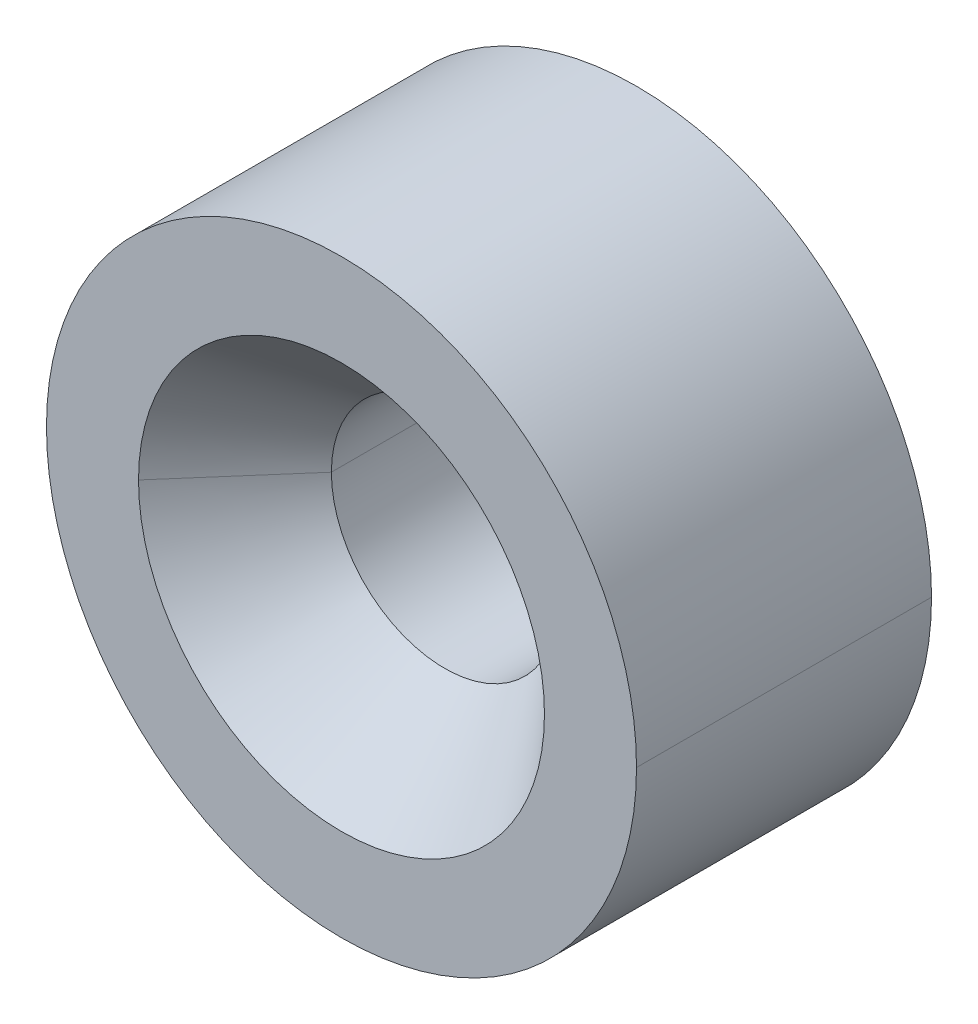
ISO-10303-21;
HEADER;
FILE_DESCRIPTION(('STEP AP214'),'2;1');
FILE_NAME('part.step','',(''),(''),'','','');
FILE_SCHEMA(('AUTOMOTIVE_DESIGN { 1 0 10303 214 1 1 1 1 }'));
ENDSEC;
DATA;
#1=APPLICATION_CONTEXT('core data for automotive mechanical design processes');
#2=APPLICATION_PROTOCOL_DEFINITION('international standard','automotive_design',2000,#1);
#3=PRODUCT_CONTEXT('',#1,'mechanical');
#4=PRODUCT('Part','Part','',(#3));
#5=PRODUCT_RELATED_PRODUCT_CATEGORY('part','',(#4));
#6=PRODUCT_DEFINITION_FORMATION('','',#4);
#7=PRODUCT_DEFINITION_CONTEXT('part definition',#1,'design');
#8=PRODUCT_DEFINITION('design','',#6,#7);
#9=PRODUCT_DEFINITION_SHAPE('','',#8);
#10=(LENGTH_UNIT() NAMED_UNIT(*) SI_UNIT(.MILLI.,.METRE.));
#11=(NAMED_UNIT(*) PLANE_ANGLE_UNIT() SI_UNIT($,.RADIAN.));
#12=(NAMED_UNIT(*) SI_UNIT($,.STERADIAN.) SOLID_ANGLE_UNIT());
#13=UNCERTAINTY_MEASURE_WITH_UNIT(LENGTH_MEASURE(1.E-05),#10,'distance_accuracy_value','');
#14=(GEOMETRIC_REPRESENTATION_CONTEXT(3) GLOBAL_UNCERTAINTY_ASSIGNED_CONTEXT((#13)) GLOBAL_UNIT_ASSIGNED_CONTEXT((#10,
#11,#12)) REPRESENTATION_CONTEXT('',''));
#15=CARTESIAN_POINT('',(0.,0.,0.));
#16=DIRECTION('',(0.,0.,1.));
#17=DIRECTION('',(1.,0.,0.));
#18=AXIS2_PLACEMENT_3D('',#15,#16,#17);
#19=CARTESIAN_POINT('',(0.,0.,3.175));
#20=DIRECTION('',(0.,0.,1.));
#21=DIRECTION('',(1.,0.,0.));
#22=AXIS2_PLACEMENT_3D('',#19,#20,#21);
#23=CONICAL_SURFACE('',#22,2.1844,0.715584993317676);
#24=CARTESIAN_POINT('',(0.,0.,2.06466441335028));
#25=DIRECTION('',(0.,0.,1.));
#26=DIRECTION('',(1.,0.,0.));
#27=AXIS2_PLACEMENT_3D('',#24,#25,#26);
#28=CIRCLE('',#27,1.2192);
#29=CARTESIAN_POINT('',(-1.2192,0.,2.06466441335028));
#30=VERTEX_POINT('',#29);
#31=CARTESIAN_POINT('',(1.2192,0.,2.06466441335028));
#32=VERTEX_POINT('',#31);
#33=EDGE_CURVE('E41',#30,#32,#28,.T.);
#34=ORIENTED_EDGE('',*,*,#33,.F.);
#35=DIRECTION('',(-0.656059028990508,0.,0.754709580222772));
#36=VECTOR('',#35,1.);
#37=CARTESIAN_POINT('',(-2.1844,0.,3.175));
#38=LINE('',#37,#36);
#39=CARTESIAN_POINT('',(-2.1844,0.,3.175));
#40=VERTEX_POINT('',#39);
#41=EDGE_CURVE('E11',#30,#40,#38,.T.);
#42=ORIENTED_EDGE('',*,*,#41,.T.);
#43=CARTESIAN_POINT('',(0.,0.,3.175));
#44=DIRECTION('',(0.,0.,1.));
#45=DIRECTION('',(1.,0.,0.));
#46=AXIS2_PLACEMENT_3D('',#43,#44,#45);
#47=CIRCLE('',#46,2.1844);
#48=CARTESIAN_POINT('',(2.1844,0.,3.175));
#49=VERTEX_POINT('',#48);
#50=EDGE_CURVE('E27',#40,#49,#47,.T.);
#51=ORIENTED_EDGE('',*,*,#50,.T.);
#52=DIRECTION('',(0.656059028990508,0.,0.754709580222772));
#53=VECTOR('',#52,1.);
#54=CARTESIAN_POINT('',(2.1844,0.,3.175));
#55=LINE('',#54,#53);
#56=EDGE_CURVE('E119',#32,#49,#55,.T.);
#57=ORIENTED_EDGE('',*,*,#56,.F.);
#58=EDGE_LOOP('',(#34,#42,#51,#57));
#59=FACE_BOUND('',#58,.T.);
#60=ADVANCED_FACE('F16',(#59),#23,.F.);
#61=CARTESIAN_POINT('',(0.,0.,3.175));
#62=DIRECTION('',(0.,0.,1.));
#63=DIRECTION('',(1.,0.,0.));
#64=AXIS2_PLACEMENT_3D('',#61,#62,#63);
#65=CYLINDRICAL_SURFACE('',#64,1.2192);
#66=CARTESIAN_POINT('',(0.,0.,0.));
#67=DIRECTION('',(0.,0.,1.));
#68=DIRECTION('',(1.,0.,0.));
#69=AXIS2_PLACEMENT_3D('',#66,#67,#68);
#70=CIRCLE('',#69,1.2192);
#71=CARTESIAN_POINT('',(-1.2192,0.,0.));
#72=VERTEX_POINT('',#71);
#73=CARTESIAN_POINT('',(1.2192,0.,0.));
#74=VERTEX_POINT('',#73);
#75=EDGE_CURVE('E20',#72,#74,#70,.T.);
#76=ORIENTED_EDGE('',*,*,#75,.F.);
#77=DIRECTION('',(0.,0.,1.));
#78=VECTOR('',#77,1.);
#79=CARTESIAN_POINT('',(-1.2192,0.,3.175));
#80=LINE('',#79,#78);
#81=EDGE_CURVE('E130',#72,#30,#80,.T.);
#82=ORIENTED_EDGE('',*,*,#81,.T.);
#83=ORIENTED_EDGE('',*,*,#33,.T.);
#84=DIRECTION('',(0.,0.,1.));
#85=VECTOR('',#84,1.);
#86=CARTESIAN_POINT('',(1.2192,0.,3.175));
#87=LINE('',#86,#85);
#88=EDGE_CURVE('E125',#74,#32,#87,.T.);
#89=ORIENTED_EDGE('',*,*,#88,.F.);
#90=EDGE_LOOP('',(#76,#82,#83,#89));
#91=FACE_BOUND('',#90,.T.);
#92=ADVANCED_FACE('F18',(#91),#65,.F.);
#93=CARTESIAN_POINT('',(0.,0.,3.175));
#94=DIRECTION('',(0.,0.,-1.));
#95=DIRECTION('',(-1.,0.,0.));
#96=AXIS2_PLACEMENT_3D('',#93,#94,#95);
#97=CYLINDRICAL_SURFACE('',#96,3.175);
#98=CARTESIAN_POINT('',(0.,0.,3.175));
#99=DIRECTION('',(0.,0.,1.));
#100=DIRECTION('',(1.,0.,0.));
#101=AXIS2_PLACEMENT_3D('',#98,#99,#100);
#102=CIRCLE('',#101,3.175);
#103=CARTESIAN_POINT('',(3.175,0.,3.175));
#104=VERTEX_POINT('',#103);
#105=CARTESIAN_POINT('',(-3.175,0.,3.175));
#106=VERTEX_POINT('',#105);
#107=EDGE_CURVE('E108',#104,#106,#102,.T.);
#108=ORIENTED_EDGE('',*,*,#107,.F.);
#109=DIRECTION('',(0.,0.,-1.));
#110=VECTOR('',#109,1.);
#111=CARTESIAN_POINT('',(3.175,0.,3.175));
#112=LINE('',#111,#110);
#113=CARTESIAN_POINT('',(3.175,0.,0.));
#114=VERTEX_POINT('',#113);
#115=EDGE_CURVE('E97',#104,#114,#112,.T.);
#116=ORIENTED_EDGE('',*,*,#115,.T.);
#117=CARTESIAN_POINT('',(0.,0.,0.));
#118=DIRECTION('',(0.,0.,1.));
#119=DIRECTION('',(1.,0.,0.));
#120=AXIS2_PLACEMENT_3D('',#117,#118,#119);
#121=CIRCLE('',#120,3.175);
#122=CARTESIAN_POINT('',(-3.175,0.,0.));
#123=VERTEX_POINT('',#122);
#124=EDGE_CURVE('E77',#114,#123,#121,.T.);
#125=ORIENTED_EDGE('',*,*,#124,.T.);
#126=DIRECTION('',(0.,0.,-1.));
#127=VECTOR('',#126,1.);
#128=CARTESIAN_POINT('',(-3.175,0.,3.175));
#129=LINE('',#128,#127);
#130=EDGE_CURVE('E87',#106,#123,#129,.T.);
#131=ORIENTED_EDGE('',*,*,#130,.F.);
#132=EDGE_LOOP('',(#108,#116,#125,#131));
#133=FACE_BOUND('',#132,.T.);
#134=ADVANCED_FACE('F96',(#133),#97,.T.);
#135=CARTESIAN_POINT('',(0.,0.,3.175));
#136=DIRECTION('',(0.,0.,-1.));
#137=DIRECTION('',(-1.,0.,0.));
#138=AXIS2_PLACEMENT_3D('',#135,#136,#137);
#139=CYLINDRICAL_SURFACE('',#138,3.175);
#140=ORIENTED_EDGE('',*,*,#115,.F.);
#141=CARTESIAN_POINT('',(0.,0.,3.175));
#142=DIRECTION('',(0.,0.,1.));
#143=DIRECTION('',(1.,0.,0.));
#144=AXIS2_PLACEMENT_3D('',#141,#142,#143);
#145=CIRCLE('',#144,3.175);
#146=EDGE_CURVE('E92',#106,#104,#145,.T.);
#147=ORIENTED_EDGE('',*,*,#146,.F.);
#148=ORIENTED_EDGE('',*,*,#130,.T.);
#149=CARTESIAN_POINT('',(0.,0.,0.));
#150=DIRECTION('',(0.,0.,1.));
#151=DIRECTION('',(1.,0.,0.));
#152=AXIS2_PLACEMENT_3D('',#149,#150,#151);
#153=CIRCLE('',#152,3.175);
#154=EDGE_CURVE('E90',#123,#114,#153,.T.);
#155=ORIENTED_EDGE('',*,*,#154,.T.);
#156=EDGE_LOOP('',(#140,#147,#148,#155));
#157=FACE_BOUND('',#156,.T.);
#158=ADVANCED_FACE('F89',(#157),#139,.T.);
#159=CARTESIAN_POINT('',(0.,0.,3.175));
#160=DIRECTION('',(0.,0.,1.));
#161=DIRECTION('',(1.,0.,0.));
#162=AXIS2_PLACEMENT_3D('',#159,#160,#161);
#163=PLANE('',#162);
#164=ORIENTED_EDGE('',*,*,#146,.T.);
#165=ORIENTED_EDGE('',*,*,#107,.T.);
#166=EDGE_LOOP('',(#164,#165));
#167=FACE_BOUND('',#166,.T.);
#168=CARTESIAN_POINT('',(0.,0.,3.175));
#169=DIRECTION('',(0.,0.,1.));
#170=DIRECTION('',(1.,0.,0.));
#171=AXIS2_PLACEMENT_3D('',#168,#169,#170);
#172=CIRCLE('',#171,2.1844);
#173=EDGE_CURVE('E115',#49,#40,#172,.T.);
#174=ORIENTED_EDGE('',*,*,#173,.F.);
#175=ORIENTED_EDGE('',*,*,#50,.F.);
#176=EDGE_LOOP('',(#174,#175));
#177=FACE_BOUND('',#176,.T.);
#178=ADVANCED_FACE('F157',(#167,#177),#163,.T.);
#179=CARTESIAN_POINT('',(0.,0.,0.));
#180=DIRECTION('',(0.,0.,1.));
#181=DIRECTION('',(1.,0.,0.));
#182=AXIS2_PLACEMENT_3D('',#179,#180,#181);
#183=PLANE('',#182);
#184=ORIENTED_EDGE('',*,*,#154,.F.);
#185=ORIENTED_EDGE('',*,*,#124,.F.);
#186=EDGE_LOOP('',(#184,#185));
#187=FACE_BOUND('',#186,.T.);
#188=CARTESIAN_POINT('',(0.,0.,0.));
#189=DIRECTION('',(0.,0.,1.));
#190=DIRECTION('',(1.,0.,0.));
#191=AXIS2_PLACEMENT_3D('',#188,#189,#190);
#192=CIRCLE('',#191,1.2192);
#193=EDGE_CURVE('E112',#74,#72,#192,.T.);
#194=ORIENTED_EDGE('',*,*,#193,.T.);
#195=ORIENTED_EDGE('',*,*,#75,.T.);
#196=EDGE_LOOP('',(#194,#195));
#197=FACE_BOUND('',#196,.T.);
#198=ADVANCED_FACE('F100',(#187,#197),#183,.F.);
#199=CARTESIAN_POINT('',(0.,0.,3.175));
#200=DIRECTION('',(0.,0.,1.));
#201=DIRECTION('',(1.,0.,0.));
#202=AXIS2_PLACEMENT_3D('',#199,#200,#201);
#203=CYLINDRICAL_SURFACE('',#202,1.2192);
#204=ORIENTED_EDGE('',*,*,#81,.F.);
#205=ORIENTED_EDGE('',*,*,#193,.F.);
#206=ORIENTED_EDGE('',*,*,#88,.T.);
#207=CARTESIAN_POINT('',(0.,0.,2.06466441335028));
#208=DIRECTION('',(0.,0.,1.));
#209=DIRECTION('',(1.,0.,0.));
#210=AXIS2_PLACEMENT_3D('',#207,#208,#209);
#211=CIRCLE('',#210,1.2192);
#212=EDGE_CURVE('E123',#32,#30,#211,.T.);
#213=ORIENTED_EDGE('',*,*,#212,.T.);
#214=EDGE_LOOP('',(#204,#205,#206,#213));
#215=FACE_BOUND('',#214,.T.);
#216=ADVANCED_FACE('F151',(#215),#203,.F.);
#217=CARTESIAN_POINT('',(0.,0.,3.175));
#218=DIRECTION('',(0.,0.,1.));
#219=DIRECTION('',(1.,0.,0.));
#220=AXIS2_PLACEMENT_3D('',#217,#218,#219);
#221=CONICAL_SURFACE('',#220,2.1844,0.715584993317676);
#222=ORIENTED_EDGE('',*,*,#41,.F.);
#223=ORIENTED_EDGE('',*,*,#212,.F.);
#224=ORIENTED_EDGE('',*,*,#56,.T.);
#225=ORIENTED_EDGE('',*,*,#173,.T.);
#226=EDGE_LOOP('',(#222,#223,#224,#225));
#227=FACE_BOUND('',#226,.T.);
#228=ADVANCED_FACE('F154',(#227),#221,.F.);
#229=CLOSED_SHELL('',(#60,#92,#134,#158,#178,#198,#216,#228));
#230=MANIFOLD_SOLID_BREP('B1',#229);
#231=ADVANCED_BREP_SHAPE_REPRESENTATION('',(#18,#230),#14);
#232=SHAPE_DEFINITION_REPRESENTATION(#9,#231);
ENDSEC;
END-ISO-10303-21;
